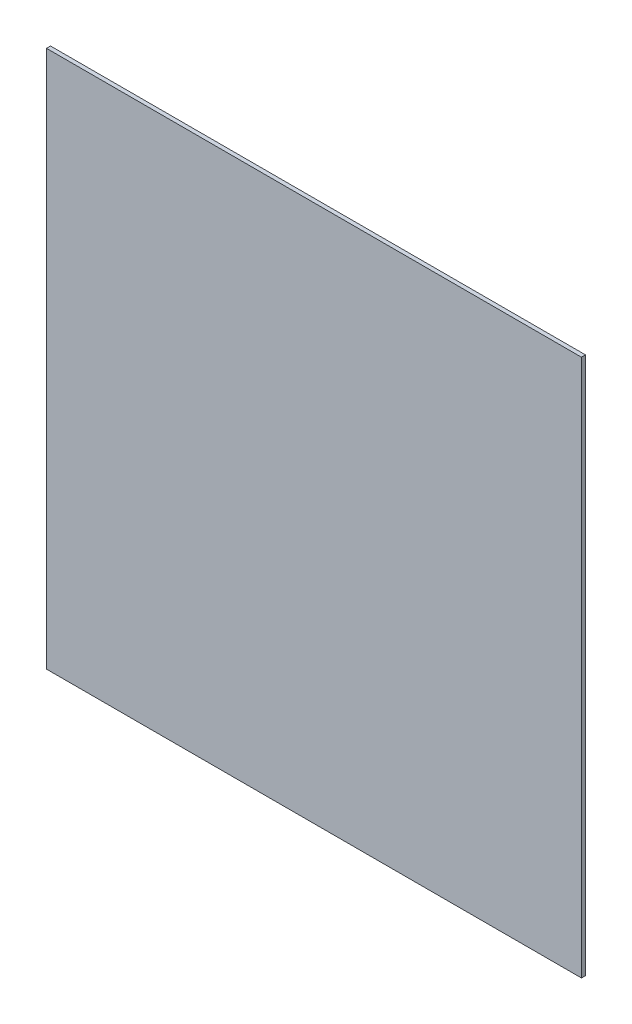
ISO-10303-21;
HEADER;
FILE_DESCRIPTION(('STEP AP214'),'2;1');
FILE_NAME('part.step','',(''),(''),'','','');
FILE_SCHEMA(('AUTOMOTIVE_DESIGN { 1 0 10303 214 1 1 1 1 }'));
ENDSEC;
DATA;
#1=APPLICATION_CONTEXT('core data for automotive mechanical design processes');
#2=APPLICATION_PROTOCOL_DEFINITION('international standard','automotive_design',2000,#1);
#3=PRODUCT_CONTEXT('',#1,'mechanical');
#4=PRODUCT('Part','Part','',(#3));
#5=PRODUCT_RELATED_PRODUCT_CATEGORY('part','',(#4));
#6=PRODUCT_DEFINITION_FORMATION('','',#4);
#7=PRODUCT_DEFINITION_CONTEXT('part definition',#1,'design');
#8=PRODUCT_DEFINITION('design','',#6,#7);
#9=PRODUCT_DEFINITION_SHAPE('','',#8);
#10=(LENGTH_UNIT() NAMED_UNIT(*) SI_UNIT(.MILLI.,.METRE.));
#11=(NAMED_UNIT(*) PLANE_ANGLE_UNIT() SI_UNIT($,.RADIAN.));
#12=(NAMED_UNIT(*) SI_UNIT($,.STERADIAN.) SOLID_ANGLE_UNIT());
#13=UNCERTAINTY_MEASURE_WITH_UNIT(LENGTH_MEASURE(1.E-05),#10,'distance_accuracy_value','');
#14=(GEOMETRIC_REPRESENTATION_CONTEXT(3) GLOBAL_UNCERTAINTY_ASSIGNED_CONTEXT((#13)) GLOBAL_UNIT_ASSIGNED_CONTEXT((#10,
#11,#12)) REPRESENTATION_CONTEXT('',''));
#15=CARTESIAN_POINT('',(0.,0.,0.));
#16=DIRECTION('',(0.,0.,1.));
#17=DIRECTION('',(1.,0.,0.));
#18=AXIS2_PLACEMENT_3D('',#15,#16,#17);
#19=CARTESIAN_POINT('',(198.5,199.5,3.));
#20=DIRECTION('',(-1.,0.,0.));
#21=DIRECTION('',(0.,-1.,0.));
#22=AXIS2_PLACEMENT_3D('',#19,#20,#21);
#23=PLANE('',#22);
#24=DIRECTION('',(0.,1.,0.));
#25=VECTOR('',#24,1.);
#26=CARTESIAN_POINT('',(198.5,199.5,0.));
#27=LINE('',#26,#25);
#28=CARTESIAN_POINT('',(198.5,-199.5,0.));
#29=VERTEX_POINT('',#28);
#30=CARTESIAN_POINT('',(198.5,199.5,0.));
#31=VERTEX_POINT('',#30);
#32=EDGE_CURVE('E107',#29,#31,#27,.T.);
#33=ORIENTED_EDGE('',*,*,#32,.T.);
#34=DIRECTION('',(0.,0.,-1.));
#35=VECTOR('',#34,1.);
#36=CARTESIAN_POINT('',(198.5,199.5,3.));
#37=LINE('',#36,#35);
#38=CARTESIAN_POINT('',(198.5,199.5,3.));
#39=VERTEX_POINT('',#38);
#40=EDGE_CURVE('E11',#39,#31,#37,.T.);
#41=ORIENTED_EDGE('',*,*,#40,.F.);
#42=DIRECTION('',(0.,1.,0.));
#43=VECTOR('',#42,1.);
#44=CARTESIAN_POINT('',(198.5,199.5,3.));
#45=LINE('',#44,#43);
#46=CARTESIAN_POINT('',(198.5,-199.5,3.));
#47=VERTEX_POINT('',#46);
#48=EDGE_CURVE('E91',#47,#39,#45,.T.);
#49=ORIENTED_EDGE('',*,*,#48,.F.);
#50=DIRECTION('',(0.,0.,-1.));
#51=VECTOR('',#50,1.);
#52=CARTESIAN_POINT('',(198.5,-199.5,3.));
#53=LINE('',#52,#51);
#54=EDGE_CURVE('E103',#47,#29,#53,.T.);
#55=ORIENTED_EDGE('',*,*,#54,.T.);
#56=EDGE_LOOP('',(#33,#41,#49,#55));
#57=FACE_BOUND('',#56,.T.);
#58=ADVANCED_FACE('F39',(#57),#23,.F.);
#59=CARTESIAN_POINT('',(-198.5,199.5,3.));
#60=DIRECTION('',(0.,-1.,0.));
#61=DIRECTION('',(0.,0.,-1.));
#62=AXIS2_PLACEMENT_3D('',#59,#60,#61);
#63=PLANE('',#62);
#64=DIRECTION('',(-1.,0.,0.));
#65=VECTOR('',#64,1.);
#66=CARTESIAN_POINT('',(-198.5,199.5,0.));
#67=LINE('',#66,#65);
#68=CARTESIAN_POINT('',(-198.5,199.5,0.));
#69=VERTEX_POINT('',#68);
#70=EDGE_CURVE('E96',#31,#69,#67,.T.);
#71=ORIENTED_EDGE('',*,*,#70,.T.);
#72=DIRECTION('',(0.,0.,-1.));
#73=VECTOR('',#72,1.);
#74=CARTESIAN_POINT('',(-198.5,199.5,3.));
#75=LINE('',#74,#73);
#76=CARTESIAN_POINT('',(-198.5,199.5,3.));
#77=VERTEX_POINT('',#76);
#78=EDGE_CURVE('E48',#77,#69,#75,.T.);
#79=ORIENTED_EDGE('',*,*,#78,.F.);
#80=DIRECTION('',(-1.,0.,0.));
#81=VECTOR('',#80,1.);
#82=CARTESIAN_POINT('',(-198.5,199.5,3.));
#83=LINE('',#82,#81);
#84=EDGE_CURVE('E86',#39,#77,#83,.T.);
#85=ORIENTED_EDGE('',*,*,#84,.F.);
#86=ORIENTED_EDGE('',*,*,#40,.T.);
#87=EDGE_LOOP('',(#71,#79,#85,#86));
#88=FACE_BOUND('',#87,.T.);
#89=ADVANCED_FACE('F95',(#88),#63,.F.);
#90=CARTESIAN_POINT('',(-198.5,199.5,3.));
#91=DIRECTION('',(1.,0.,0.));
#92=DIRECTION('',(0.,1.,0.));
#93=AXIS2_PLACEMENT_3D('',#90,#91,#92);
#94=PLANE('',#93);
#95=DIRECTION('',(0.,-1.,0.));
#96=VECTOR('',#95,1.);
#97=CARTESIAN_POINT('',(-198.5,199.5,0.));
#98=LINE('',#97,#96);
#99=CARTESIAN_POINT('',(-198.5,-199.5,0.));
#100=VERTEX_POINT('',#99);
#101=EDGE_CURVE('E73',#69,#100,#98,.T.);
#102=ORIENTED_EDGE('',*,*,#101,.T.);
#103=DIRECTION('',(0.,0.,-1.));
#104=VECTOR('',#103,1.);
#105=CARTESIAN_POINT('',(-198.5,-199.5,3.));
#106=LINE('',#105,#104);
#107=CARTESIAN_POINT('',(-198.5,-199.5,3.));
#108=VERTEX_POINT('',#107);
#109=EDGE_CURVE('E98',#108,#100,#106,.T.);
#110=ORIENTED_EDGE('',*,*,#109,.F.);
#111=DIRECTION('',(0.,-1.,0.));
#112=VECTOR('',#111,1.);
#113=CARTESIAN_POINT('',(-198.5,199.5,3.));
#114=LINE('',#113,#112);
#115=EDGE_CURVE('E89',#77,#108,#114,.T.);
#116=ORIENTED_EDGE('',*,*,#115,.F.);
#117=ORIENTED_EDGE('',*,*,#78,.T.);
#118=EDGE_LOOP('',(#102,#110,#116,#117));
#119=FACE_BOUND('',#118,.T.);
#120=ADVANCED_FACE('F99',(#119),#94,.F.);
#121=CARTESIAN_POINT('',(-198.5,-199.5,3.));
#122=DIRECTION('',(0.,1.,0.));
#123=DIRECTION('',(0.,0.,1.));
#124=AXIS2_PLACEMENT_3D('',#121,#122,#123);
#125=PLANE('',#124);
#126=DIRECTION('',(1.,0.,0.));
#127=VECTOR('',#126,1.);
#128=CARTESIAN_POINT('',(-198.5,-199.5,0.));
#129=LINE('',#128,#127);
#130=EDGE_CURVE('E79',#100,#29,#129,.T.);
#131=ORIENTED_EDGE('',*,*,#130,.T.);
#132=ORIENTED_EDGE('',*,*,#54,.F.);
#133=DIRECTION('',(1.,0.,0.));
#134=VECTOR('',#133,1.);
#135=CARTESIAN_POINT('',(-198.5,-199.5,3.));
#136=LINE('',#135,#134);
#137=EDGE_CURVE('E56',#108,#47,#136,.T.);
#138=ORIENTED_EDGE('',*,*,#137,.F.);
#139=ORIENTED_EDGE('',*,*,#109,.T.);
#140=EDGE_LOOP('',(#131,#132,#138,#139));
#141=FACE_BOUND('',#140,.T.);
#142=ADVANCED_FACE('F120',(#141),#125,.F.);
#143=CARTESIAN_POINT('',(0.,0.,3.));
#144=DIRECTION('',(0.,0.,1.));
#145=DIRECTION('',(1.,0.,0.));
#146=AXIS2_PLACEMENT_3D('',#143,#144,#145);
#147=PLANE('',#146);
#148=ORIENTED_EDGE('',*,*,#48,.T.);
#149=ORIENTED_EDGE('',*,*,#84,.T.);
#150=ORIENTED_EDGE('',*,*,#115,.T.);
#151=ORIENTED_EDGE('',*,*,#137,.T.);
#152=EDGE_LOOP('',(#148,#149,#150,#151));
#153=FACE_BOUND('',#152,.T.);
#154=ADVANCED_FACE('F87',(#153),#147,.T.);
#155=CARTESIAN_POINT('',(0.,0.,0.));
#156=DIRECTION('',(0.,0.,1.));
#157=DIRECTION('',(1.,0.,0.));
#158=AXIS2_PLACEMENT_3D('',#155,#156,#157);
#159=PLANE('',#158);
#160=ORIENTED_EDGE('',*,*,#32,.F.);
#161=ORIENTED_EDGE('',*,*,#130,.F.);
#162=ORIENTED_EDGE('',*,*,#101,.F.);
#163=ORIENTED_EDGE('',*,*,#70,.F.);
#164=EDGE_LOOP('',(#160,#161,#162,#163));
#165=FACE_BOUND('',#164,.T.);
#166=ADVANCED_FACE('F123',(#165),#159,.F.);
#167=CLOSED_SHELL('',(#58,#89,#120,#142,#154,#166));
#168=MANIFOLD_SOLID_BREP('B2',#167);
#169=ADVANCED_BREP_SHAPE_REPRESENTATION('',(#18,#168),#14);
#170=SHAPE_DEFINITION_REPRESENTATION(#9,#169);
ENDSEC;
END-ISO-10303-21;
